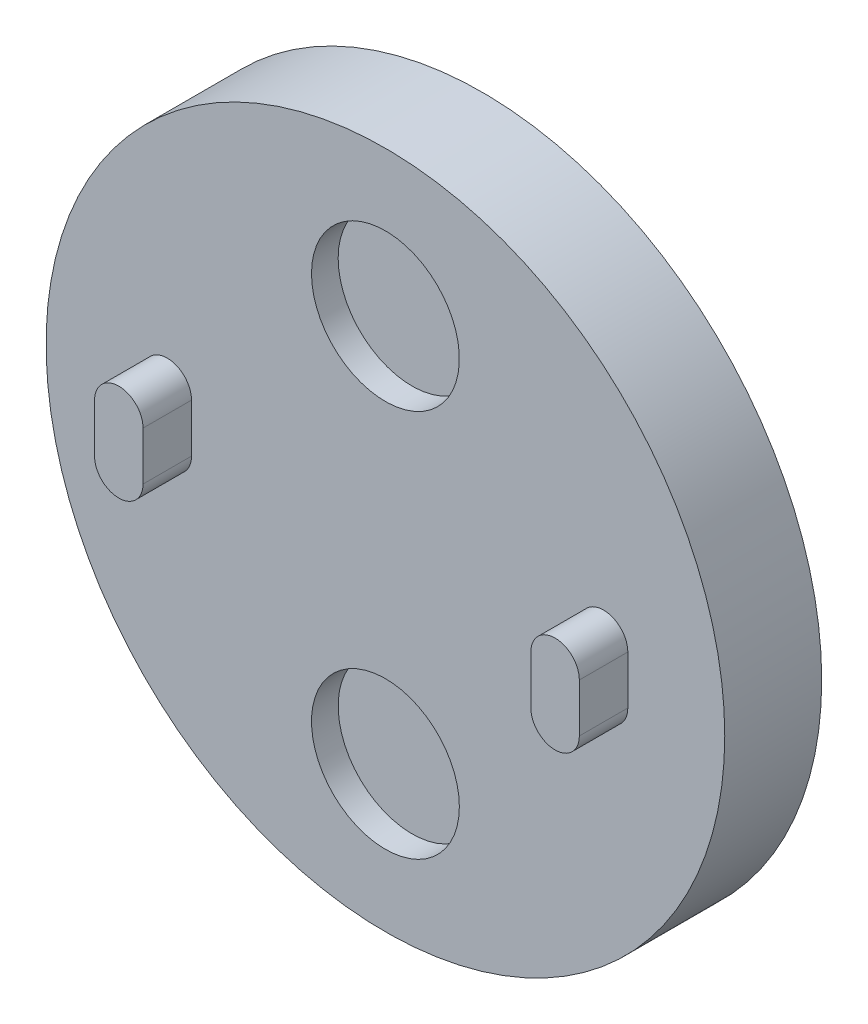
ISO-10303-21;
HEADER;
FILE_DESCRIPTION(('STEP AP214'),'2;1');
FILE_NAME('part.step','',(''),(''),'','','');
FILE_SCHEMA(('AUTOMOTIVE_DESIGN { 1 0 10303 214 1 1 1 1 }'));
ENDSEC;
DATA;
#1=APPLICATION_CONTEXT('core data for automotive mechanical design processes');
#2=APPLICATION_PROTOCOL_DEFINITION('international standard','automotive_design',2000,#1);
#3=PRODUCT_CONTEXT('',#1,'mechanical');
#4=PRODUCT('Part','Part','',(#3));
#5=PRODUCT_RELATED_PRODUCT_CATEGORY('part','',(#4));
#6=PRODUCT_DEFINITION_FORMATION('','',#4);
#7=PRODUCT_DEFINITION_CONTEXT('part definition',#1,'design');
#8=PRODUCT_DEFINITION('design','',#6,#7);
#9=PRODUCT_DEFINITION_SHAPE('','',#8);
#10=(LENGTH_UNIT() NAMED_UNIT(*) SI_UNIT(.MILLI.,.METRE.));
#11=(NAMED_UNIT(*) PLANE_ANGLE_UNIT() SI_UNIT($,.RADIAN.));
#12=(NAMED_UNIT(*) SI_UNIT($,.STERADIAN.) SOLID_ANGLE_UNIT());
#13=UNCERTAINTY_MEASURE_WITH_UNIT(LENGTH_MEASURE(1.E-05),#10,'distance_accuracy_value','');
#14=(GEOMETRIC_REPRESENTATION_CONTEXT(3) GLOBAL_UNCERTAINTY_ASSIGNED_CONTEXT((#13)) GLOBAL_UNIT_ASSIGNED_CONTEXT((#10,
#11,#12)) REPRESENTATION_CONTEXT('',''));
#15=CARTESIAN_POINT('',(0.,0.,0.));
#16=DIRECTION('',(0.,0.,1.));
#17=DIRECTION('',(1.,0.,0.));
#18=AXIS2_PLACEMENT_3D('',#15,#16,#17);
#19=CARTESIAN_POINT('',(0.,8.,-50.6128116588933));
#20=DIRECTION('',(0.,0.,1.));
#21=DIRECTION('',(1.,0.,0.));
#22=AXIS2_PLACEMENT_3D('',#19,#20,#21);
#23=PLANE('',#22);
#24=CARTESIAN_POINT('',(0.,0.,-50.6128116588933));
#25=DIRECTION('',(0.,0.,1.));
#26=DIRECTION('',(1.,0.,0.));
#27=AXIS2_PLACEMENT_3D('',#24,#25,#26);
#28=CIRCLE('',#27,3.05);
#29=CARTESIAN_POINT('',(3.05,0.,-50.6128116588933));
#30=VERTEX_POINT('',#29);
#31=EDGE_CURVE('E231',#30,#30,#28,.T.);
#32=ORIENTED_EDGE('',*,*,#31,.F.);
#33=EDGE_LOOP('',(#32));
#34=FACE_BOUND('',#33,.T.);
#35=CARTESIAN_POINT('',(0.,16.,-50.6128116588933));
#36=DIRECTION('',(0.,0.,1.));
#37=DIRECTION('',(-1.,0.,0.));
#38=AXIS2_PLACEMENT_3D('',#35,#36,#37);
#39=CIRCLE('',#38,3.05);
#40=CARTESIAN_POINT('',(-3.05,16.,-50.6128116588933));
#41=VERTEX_POINT('',#40);
#42=EDGE_CURVE('E234',#41,#41,#39,.T.);
#43=ORIENTED_EDGE('',*,*,#42,.F.);
#44=EDGE_LOOP('',(#43));
#45=FACE_BOUND('',#44,.T.);
#46=CARTESIAN_POINT('',(0.,8.,-50.6128116588933));
#47=DIRECTION('',(0.,0.,1.));
#48=DIRECTION('',(1.,0.,0.));
#49=AXIS2_PLACEMENT_3D('',#46,#47,#48);
#50=CIRCLE('',#49,14.);
#51=CARTESIAN_POINT('',(14.,8.,-50.6128116588933));
#52=VERTEX_POINT('',#51);
#53=EDGE_CURVE('E11',#52,#52,#50,.T.);
#54=ORIENTED_EDGE('',*,*,#53,.T.);
#55=EDGE_LOOP('',(#54));
#56=FACE_BOUND('',#55,.T.);
#57=DIRECTION('',(0.,-1.,0.));
#58=VECTOR('',#57,1.);
#59=CARTESIAN_POINT('',(-9.99999999999999,9.,-50.6128116588933));
#60=LINE('',#59,#58);
#61=CARTESIAN_POINT('',(-9.99999999999999,9.,-50.6128116588933));
#62=VERTEX_POINT('',#61);
#63=CARTESIAN_POINT('',(-9.99999999999999,7.,-50.6128116588933));
#64=VERTEX_POINT('',#63);
#65=EDGE_CURVE('E212',#62,#64,#60,.T.);
#66=ORIENTED_EDGE('',*,*,#65,.F.);
#67=CARTESIAN_POINT('',(-8.99999999999999,9.,-50.6128116588933));
#68=DIRECTION('',(0.,0.,1.));
#69=DIRECTION('',(1.,0.,0.));
#70=AXIS2_PLACEMENT_3D('',#67,#68,#69);
#71=CIRCLE('',#70,1.);
#72=CARTESIAN_POINT('',(-7.99999999999999,9.,-50.6128116588933));
#73=VERTEX_POINT('',#72);
#74=EDGE_CURVE('E191',#73,#62,#71,.T.);
#75=ORIENTED_EDGE('',*,*,#74,.F.);
#76=DIRECTION('',(0.,1.,0.));
#77=VECTOR('',#76,1.);
#78=CARTESIAN_POINT('',(-7.99999999999999,9.,-50.6128116588933));
#79=LINE('',#78,#77);
#80=CARTESIAN_POINT('',(-7.99999999999999,7.,-50.6128116588933));
#81=VERTEX_POINT('',#80);
#82=EDGE_CURVE('E203',#81,#73,#79,.T.);
#83=ORIENTED_EDGE('',*,*,#82,.F.);
#84=CARTESIAN_POINT('',(-8.99999999999999,7.,-50.6128116588933));
#85=DIRECTION('',(0.,0.,1.));
#86=DIRECTION('',(1.,0.,0.));
#87=AXIS2_PLACEMENT_3D('',#84,#85,#86);
#88=CIRCLE('',#87,1.);
#89=EDGE_CURVE('E214',#64,#81,#88,.T.);
#90=ORIENTED_EDGE('',*,*,#89,.F.);
#91=EDGE_LOOP('',(#66,#75,#83,#90));
#92=FACE_BOUND('',#91,.T.);
#93=DIRECTION('',(0.,-1.,0.));
#94=VECTOR('',#93,1.);
#95=CARTESIAN_POINT('',(8.00000000000001,9.,-50.6128116588933));
#96=LINE('',#95,#94);
#97=CARTESIAN_POINT('',(8.00000000000001,9.,-50.6128116588933));
#98=VERTEX_POINT('',#97);
#99=CARTESIAN_POINT('',(8.00000000000001,7.,-50.6128116588933));
#100=VERTEX_POINT('',#99);
#101=EDGE_CURVE('E186',#98,#100,#96,.T.);
#102=ORIENTED_EDGE('',*,*,#101,.F.);
#103=CARTESIAN_POINT('',(9.00000000000001,9.,-50.6128116588933));
#104=DIRECTION('',(0.,0.,1.));
#105=DIRECTION('',(-1.,0.,0.));
#106=AXIS2_PLACEMENT_3D('',#103,#104,#105);
#107=CIRCLE('',#106,1.);
#108=CARTESIAN_POINT('',(10.,9.,-50.6128116588933));
#109=VERTEX_POINT('',#108);
#110=EDGE_CURVE('E188',#109,#98,#107,.T.);
#111=ORIENTED_EDGE('',*,*,#110,.F.);
#112=DIRECTION('',(0.,1.,0.));
#113=VECTOR('',#112,1.);
#114=CARTESIAN_POINT('',(10.,9.,-50.6128116588933));
#115=LINE('',#114,#113);
#116=CARTESIAN_POINT('',(10.,7.,-50.6128116588933));
#117=VERTEX_POINT('',#116);
#118=EDGE_CURVE('E181',#117,#109,#115,.T.);
#119=ORIENTED_EDGE('',*,*,#118,.F.);
#120=CARTESIAN_POINT('',(9.00000000000001,7.,-50.6128116588933));
#121=DIRECTION('',(0.,0.,1.));
#122=DIRECTION('',(-1.,0.,0.));
#123=AXIS2_PLACEMENT_3D('',#120,#121,#122);
#124=CIRCLE('',#123,1.);
#125=EDGE_CURVE('E183',#100,#117,#124,.T.);
#126=ORIENTED_EDGE('',*,*,#125,.F.);
#127=EDGE_LOOP('',(#102,#111,#119,#126));
#128=FACE_BOUND('',#127,.T.);
#129=ADVANCED_FACE('F43',(#34,#45,#56,#92,#128),#23,.T.);
#130=CARTESIAN_POINT('',(0.,8.,-50.6128116588933));
#131=DIRECTION('',(0.,0.,-1.));
#132=DIRECTION('',(-1.,0.,0.));
#133=AXIS2_PLACEMENT_3D('',#130,#131,#132);
#134=CYLINDRICAL_SURFACE('',#133,14.);
#135=ORIENTED_EDGE('',*,*,#53,.F.);
#136=EDGE_LOOP('',(#135));
#137=FACE_BOUND('',#136,.T.);
#138=CARTESIAN_POINT('',(0.,8.,-54.6128116588933));
#139=DIRECTION('',(0.,0.,1.));
#140=DIRECTION('',(1.,0.,0.));
#141=AXIS2_PLACEMENT_3D('',#138,#139,#140);
#142=CIRCLE('',#141,14.);
#143=CARTESIAN_POINT('',(14.,8.,-54.6128116588933));
#144=VERTEX_POINT('',#143);
#145=EDGE_CURVE('E51',#144,#144,#142,.T.);
#146=ORIENTED_EDGE('',*,*,#145,.T.);
#147=EDGE_LOOP('',(#146));
#148=FACE_BOUND('',#147,.T.);
#149=ADVANCED_FACE('F45',(#137,#148),#134,.T.);
#150=CARTESIAN_POINT('',(0.,8.,-54.6128116588933));
#151=DIRECTION('',(0.,0.,1.));
#152=DIRECTION('',(1.,0.,0.));
#153=AXIS2_PLACEMENT_3D('',#150,#151,#152);
#154=PLANE('',#153);
#155=DIRECTION('',(0.,-1.,0.));
#156=VECTOR('',#155,1.);
#157=CARTESIAN_POINT('',(1.55,10.0248456731317,-54.6128116588933));
#158=LINE('',#157,#156);
#159=CARTESIAN_POINT('',(1.55,10.0248456731317,-54.6128116588933));
#160=VERTEX_POINT('',#159);
#161=CARTESIAN_POINT('',(1.55,5.97515432686833,-54.6128116588933));
#162=VERTEX_POINT('',#161);
#163=EDGE_CURVE('E162',#160,#162,#158,.T.);
#164=ORIENTED_EDGE('',*,*,#163,.F.);
#165=CARTESIAN_POINT('',(0.,7.99999999999999,-54.6128116588933));
#166=DIRECTION('',(0.,0.,-1.));
#167=DIRECTION('',(-1.,0.,0.));
#168=AXIS2_PLACEMENT_3D('',#165,#166,#167);
#169=CIRCLE('',#168,2.55);
#170=CARTESIAN_POINT('',(-1.55,10.0248456731317,-54.6128116588933));
#171=VERTEX_POINT('',#170);
#172=EDGE_CURVE('E58',#171,#160,#169,.T.);
#173=ORIENTED_EDGE('',*,*,#172,.F.);
#174=DIRECTION('',(0.,1.,0.));
#175=VECTOR('',#174,1.);
#176=CARTESIAN_POINT('',(-1.55,10.0248456731317,-54.6128116588933));
#177=LINE('',#176,#175);
#178=CARTESIAN_POINT('',(-1.55,5.97515432686833,-54.6128116588933));
#179=VERTEX_POINT('',#178);
#180=EDGE_CURVE('E153',#179,#171,#177,.T.);
#181=ORIENTED_EDGE('',*,*,#180,.F.);
#182=CARTESIAN_POINT('',(0.,7.99999999999999,-54.6128116588933));
#183=DIRECTION('',(0.,0.,-1.));
#184=DIRECTION('',(-1.,0.,0.));
#185=AXIS2_PLACEMENT_3D('',#182,#183,#184);
#186=CIRCLE('',#185,2.55);
#187=EDGE_CURVE('E156',#162,#179,#186,.T.);
#188=ORIENTED_EDGE('',*,*,#187,.F.);
#189=EDGE_LOOP('',(#164,#173,#181,#188));
#190=FACE_BOUND('',#189,.T.);
#191=ORIENTED_EDGE('',*,*,#145,.F.);
#192=EDGE_LOOP('',(#191));
#193=FACE_BOUND('',#192,.T.);
#194=ADVANCED_FACE('F242',(#190,#193),#154,.F.);
#195=CARTESIAN_POINT('',(0.,16.,-51.7128116588933));
#196=DIRECTION('',(0.,0.,1.));
#197=DIRECTION('',(1.,0.,0.));
#198=AXIS2_PLACEMENT_3D('',#195,#196,#197);
#199=CYLINDRICAL_SURFACE('',#198,3.05);
#200=CARTESIAN_POINT('',(0.,16.,-51.7128116588933));
#201=DIRECTION('',(0.,0.,1.));
#202=DIRECTION('',(-1.,0.,0.));
#203=AXIS2_PLACEMENT_3D('',#200,#201,#202);
#204=CIRCLE('',#203,3.05);
#205=CARTESIAN_POINT('',(-3.05,16.,-51.7128116588933));
#206=VERTEX_POINT('',#205);
#207=EDGE_CURVE('E227',#206,#206,#204,.T.);
#208=ORIENTED_EDGE('',*,*,#207,.F.);
#209=EDGE_LOOP('',(#208));
#210=FACE_BOUND('',#209,.T.);
#211=ORIENTED_EDGE('',*,*,#42,.T.);
#212=EDGE_LOOP('',(#211));
#213=FACE_BOUND('',#212,.T.);
#214=ADVANCED_FACE('F244',(#210,#213),#199,.F.);
#215=CARTESIAN_POINT('',(0.,16.,-51.7128116588933));
#216=DIRECTION('',(0.,0.,-1.));
#217=DIRECTION('',(-1.,0.,0.));
#218=AXIS2_PLACEMENT_3D('',#215,#216,#217);
#219=PLANE('',#218);
#220=ORIENTED_EDGE('',*,*,#207,.T.);
#221=EDGE_LOOP('',(#220));
#222=FACE_BOUND('',#221,.T.);
#223=ADVANCED_FACE('F251',(#222),#219,.F.);
#224=CARTESIAN_POINT('',(0.,0.,-51.7128116588933));
#225=DIRECTION('',(0.,0.,1.));
#226=DIRECTION('',(1.,0.,0.));
#227=AXIS2_PLACEMENT_3D('',#224,#225,#226);
#228=CYLINDRICAL_SURFACE('',#227,3.05);
#229=CARTESIAN_POINT('',(0.,0.,-51.7128116588933));
#230=DIRECTION('',(0.,0.,1.));
#231=DIRECTION('',(1.,0.,0.));
#232=AXIS2_PLACEMENT_3D('',#229,#230,#231);
#233=CIRCLE('',#232,3.05);
#234=CARTESIAN_POINT('',(3.05,0.,-51.7128116588933));
#235=VERTEX_POINT('',#234);
#236=EDGE_CURVE('E228',#235,#235,#233,.T.);
#237=ORIENTED_EDGE('',*,*,#236,.F.);
#238=EDGE_LOOP('',(#237));
#239=FACE_BOUND('',#238,.T.);
#240=ORIENTED_EDGE('',*,*,#31,.T.);
#241=EDGE_LOOP('',(#240));
#242=FACE_BOUND('',#241,.T.);
#243=ADVANCED_FACE('F321',(#239,#242),#228,.F.);
#244=CARTESIAN_POINT('',(0.,0.,-51.7128116588933));
#245=DIRECTION('',(0.,0.,1.));
#246=DIRECTION('',(1.,0.,0.));
#247=AXIS2_PLACEMENT_3D('',#244,#245,#246);
#248=PLANE('',#247);
#249=ORIENTED_EDGE('',*,*,#236,.T.);
#250=EDGE_LOOP('',(#249));
#251=FACE_BOUND('',#250,.T.);
#252=ADVANCED_FACE('F317',(#251),#248,.T.);
#253=CARTESIAN_POINT('',(-8.99999999999999,9.,-48.6128116588933));
#254=DIRECTION('',(0.,0.,-1.));
#255=DIRECTION('',(-1.,0.,0.));
#256=AXIS2_PLACEMENT_3D('',#253,#254,#255);
#257=CYLINDRICAL_SURFACE('',#256,1.);
#258=ORIENTED_EDGE('',*,*,#74,.T.);
#259=DIRECTION('',(0.,0.,-1.));
#260=VECTOR('',#259,1.);
#261=CARTESIAN_POINT('',(-9.99999999999999,9.,-48.6128116588933));
#262=LINE('',#261,#260);
#263=CARTESIAN_POINT('',(-9.99999999999999,9.,-48.6128116588933));
#264=VERTEX_POINT('',#263);
#265=EDGE_CURVE('E225',#264,#62,#262,.T.);
#266=ORIENTED_EDGE('',*,*,#265,.F.);
#267=CARTESIAN_POINT('',(-8.99999999999999,9.,-48.6128116588933));
#268=DIRECTION('',(0.,0.,1.));
#269=DIRECTION('',(1.,0.,0.));
#270=AXIS2_PLACEMENT_3D('',#267,#268,#269);
#271=CIRCLE('',#270,1.);
#272=CARTESIAN_POINT('',(-7.99999999999999,9.,-48.6128116588933));
#273=VERTEX_POINT('',#272);
#274=EDGE_CURVE('E199',#273,#264,#271,.T.);
#275=ORIENTED_EDGE('',*,*,#274,.F.);
#276=DIRECTION('',(0.,0.,-1.));
#277=VECTOR('',#276,1.);
#278=CARTESIAN_POINT('',(-7.99999999999999,9.,-48.6128116588933));
#279=LINE('',#278,#277);
#280=EDGE_CURVE('E209',#273,#73,#279,.T.);
#281=ORIENTED_EDGE('',*,*,#280,.T.);
#282=EDGE_LOOP('',(#258,#266,#275,#281));
#283=FACE_BOUND('',#282,.T.);
#284=ADVANCED_FACE('F313',(#283),#257,.T.);
#285=CARTESIAN_POINT('',(-9.99999999999999,9.,-48.6128116588933));
#286=DIRECTION('',(1.,0.,0.));
#287=DIRECTION('',(0.,0.,-1.));
#288=AXIS2_PLACEMENT_3D('',#285,#286,#287);
#289=PLANE('',#288);
#290=ORIENTED_EDGE('',*,*,#65,.T.);
#291=DIRECTION('',(0.,0.,-1.));
#292=VECTOR('',#291,1.);
#293=CARTESIAN_POINT('',(-9.99999999999999,7.,-48.6128116588933));
#294=LINE('',#293,#292);
#295=CARTESIAN_POINT('',(-9.99999999999999,7.,-48.6128116588933));
#296=VERTEX_POINT('',#295);
#297=EDGE_CURVE('E222',#296,#64,#294,.T.);
#298=ORIENTED_EDGE('',*,*,#297,.F.);
#299=DIRECTION('',(0.,-1.,0.));
#300=VECTOR('',#299,1.);
#301=CARTESIAN_POINT('',(-9.99999999999999,9.,-48.6128116588933));
#302=LINE('',#301,#300);
#303=EDGE_CURVE('E202',#264,#296,#302,.T.);
#304=ORIENTED_EDGE('',*,*,#303,.F.);
#305=ORIENTED_EDGE('',*,*,#265,.T.);
#306=EDGE_LOOP('',(#290,#298,#304,#305));
#307=FACE_BOUND('',#306,.T.);
#308=ADVANCED_FACE('F309',(#307),#289,.F.);
#309=CARTESIAN_POINT('',(-8.99999999999999,7.,-48.6128116588933));
#310=DIRECTION('',(0.,0.,-1.));
#311=DIRECTION('',(-1.,0.,0.));
#312=AXIS2_PLACEMENT_3D('',#309,#310,#311);
#313=CYLINDRICAL_SURFACE('',#312,1.);
#314=ORIENTED_EDGE('',*,*,#89,.T.);
#315=DIRECTION('',(0.,0.,-1.));
#316=VECTOR('',#315,1.);
#317=CARTESIAN_POINT('',(-7.99999999999999,7.,-48.6128116588933));
#318=LINE('',#317,#316);
#319=CARTESIAN_POINT('',(-7.99999999999999,7.,-48.6128116588933));
#320=VERTEX_POINT('',#319);
#321=EDGE_CURVE('E220',#320,#81,#318,.T.);
#322=ORIENTED_EDGE('',*,*,#321,.F.);
#323=CARTESIAN_POINT('',(-8.99999999999999,7.,-48.6128116588933));
#324=DIRECTION('',(0.,0.,1.));
#325=DIRECTION('',(1.,0.,0.));
#326=AXIS2_PLACEMENT_3D('',#323,#324,#325);
#327=CIRCLE('',#326,1.);
#328=EDGE_CURVE('E205',#296,#320,#327,.T.);
#329=ORIENTED_EDGE('',*,*,#328,.F.);
#330=ORIENTED_EDGE('',*,*,#297,.T.);
#331=EDGE_LOOP('',(#314,#322,#329,#330));
#332=FACE_BOUND('',#331,.T.);
#333=ADVANCED_FACE('F305',(#332),#313,.T.);
#334=CARTESIAN_POINT('',(-7.99999999999999,9.,-48.6128116588933));
#335=DIRECTION('',(-1.,0.,0.));
#336=DIRECTION('',(0.,0.,1.));
#337=AXIS2_PLACEMENT_3D('',#334,#335,#336);
#338=PLANE('',#337);
#339=ORIENTED_EDGE('',*,*,#82,.T.);
#340=ORIENTED_EDGE('',*,*,#280,.F.);
#341=DIRECTION('',(0.,1.,0.));
#342=VECTOR('',#341,1.);
#343=CARTESIAN_POINT('',(-7.99999999999999,9.,-48.6128116588933));
#344=LINE('',#343,#342);
#345=EDGE_CURVE('E207',#320,#273,#344,.T.);
#346=ORIENTED_EDGE('',*,*,#345,.F.);
#347=ORIENTED_EDGE('',*,*,#321,.T.);
#348=EDGE_LOOP('',(#339,#340,#346,#347));
#349=FACE_BOUND('',#348,.T.);
#350=ADVANCED_FACE('F301',(#349),#338,.F.);
#351=CARTESIAN_POINT('',(-8.99999999999999,9.,-48.6128116588933));
#352=DIRECTION('',(0.,0.,1.));
#353=DIRECTION('',(1.,0.,0.));
#354=AXIS2_PLACEMENT_3D('',#351,#352,#353);
#355=PLANE('',#354);
#356=ORIENTED_EDGE('',*,*,#274,.T.);
#357=ORIENTED_EDGE('',*,*,#303,.T.);
#358=ORIENTED_EDGE('',*,*,#328,.T.);
#359=ORIENTED_EDGE('',*,*,#345,.T.);
#360=EDGE_LOOP('',(#356,#357,#358,#359));
#361=FACE_BOUND('',#360,.T.);
#362=ADVANCED_FACE('F298',(#361),#355,.T.);
#363=CARTESIAN_POINT('',(9.00000000000001,9.,-48.6128116588933));
#364=DIRECTION('',(0.,0.,-1.));
#365=DIRECTION('',(-1.,0.,0.));
#366=AXIS2_PLACEMENT_3D('',#363,#364,#365);
#367=CYLINDRICAL_SURFACE('',#366,1.);
#368=ORIENTED_EDGE('',*,*,#110,.T.);
#369=DIRECTION('',(0.,0.,-1.));
#370=VECTOR('',#369,1.);
#371=CARTESIAN_POINT('',(8.00000000000001,9.,-48.6128116588933));
#372=LINE('',#371,#370);
#373=CARTESIAN_POINT('',(8.00000000000001,9.,-48.6128116588933));
#374=VERTEX_POINT('',#373);
#375=EDGE_CURVE('E168',#374,#98,#372,.T.);
#376=ORIENTED_EDGE('',*,*,#375,.F.);
#377=CARTESIAN_POINT('',(9.00000000000001,9.,-48.6128116588933));
#378=DIRECTION('',(0.,0.,1.));
#379=DIRECTION('',(-1.,0.,0.));
#380=AXIS2_PLACEMENT_3D('',#377,#378,#379);
#381=CIRCLE('',#380,1.);
#382=CARTESIAN_POINT('',(10.,9.,-48.6128116588933));
#383=VERTEX_POINT('',#382);
#384=EDGE_CURVE('E184',#383,#374,#381,.T.);
#385=ORIENTED_EDGE('',*,*,#384,.F.);
#386=DIRECTION('',(0.,0.,-1.));
#387=VECTOR('',#386,1.);
#388=CARTESIAN_POINT('',(10.,9.,-48.6128116588933));
#389=LINE('',#388,#387);
#390=EDGE_CURVE('E177',#383,#109,#389,.T.);
#391=ORIENTED_EDGE('',*,*,#390,.T.);
#392=EDGE_LOOP('',(#368,#376,#385,#391));
#393=FACE_BOUND('',#392,.T.);
#394=ADVANCED_FACE('F286',(#393),#367,.T.);
#395=CARTESIAN_POINT('',(8.00000000000001,9.,-48.6128116588933));
#396=DIRECTION('',(1.,0.,0.));
#397=DIRECTION('',(0.,0.,-1.));
#398=AXIS2_PLACEMENT_3D('',#395,#396,#397);
#399=PLANE('',#398);
#400=ORIENTED_EDGE('',*,*,#101,.T.);
#401=DIRECTION('',(0.,0.,-1.));
#402=VECTOR('',#401,1.);
#403=CARTESIAN_POINT('',(8.00000000000001,7.,-48.6128116588933));
#404=LINE('',#403,#402);
#405=CARTESIAN_POINT('',(8.00000000000001,7.,-48.6128116588933));
#406=VERTEX_POINT('',#405);
#407=EDGE_CURVE('E173',#406,#100,#404,.T.);
#408=ORIENTED_EDGE('',*,*,#407,.F.);
#409=DIRECTION('',(0.,-1.,0.));
#410=VECTOR('',#409,1.);
#411=CARTESIAN_POINT('',(8.00000000000001,9.,-48.6128116588933));
#412=LINE('',#411,#410);
#413=EDGE_CURVE('E195',#374,#406,#412,.T.);
#414=ORIENTED_EDGE('',*,*,#413,.F.);
#415=ORIENTED_EDGE('',*,*,#375,.T.);
#416=EDGE_LOOP('',(#400,#408,#414,#415));
#417=FACE_BOUND('',#416,.T.);
#418=ADVANCED_FACE('F276',(#417),#399,.F.);
#419=CARTESIAN_POINT('',(9.00000000000001,7.,-48.6128116588933));
#420=DIRECTION('',(0.,0.,-1.));
#421=DIRECTION('',(-1.,0.,0.));
#422=AXIS2_PLACEMENT_3D('',#419,#420,#421);
#423=CYLINDRICAL_SURFACE('',#422,1.);
#424=ORIENTED_EDGE('',*,*,#125,.T.);
#425=DIRECTION('',(0.,0.,-1.));
#426=VECTOR('',#425,1.);
#427=CARTESIAN_POINT('',(10.,7.,-48.6128116588933));
#428=LINE('',#427,#426);
#429=CARTESIAN_POINT('',(10.,7.,-48.6128116588933));
#430=VERTEX_POINT('',#429);
#431=EDGE_CURVE('E66',#430,#117,#428,.T.);
#432=ORIENTED_EDGE('',*,*,#431,.F.);
#433=CARTESIAN_POINT('',(9.00000000000001,7.,-48.6128116588933));
#434=DIRECTION('',(0.,0.,1.));
#435=DIRECTION('',(-1.,0.,0.));
#436=AXIS2_PLACEMENT_3D('',#433,#434,#435);
#437=CIRCLE('',#436,1.);
#438=EDGE_CURVE('E193',#406,#430,#437,.T.);
#439=ORIENTED_EDGE('',*,*,#438,.F.);
#440=ORIENTED_EDGE('',*,*,#407,.T.);
#441=EDGE_LOOP('',(#424,#432,#439,#440));
#442=FACE_BOUND('',#441,.T.);
#443=ADVANCED_FACE('F280',(#442),#423,.T.);
#444=CARTESIAN_POINT('',(10.,9.,-48.6128116588933));
#445=DIRECTION('',(-1.,0.,0.));
#446=DIRECTION('',(0.,0.,1.));
#447=AXIS2_PLACEMENT_3D('',#444,#445,#446);
#448=PLANE('',#447);
#449=ORIENTED_EDGE('',*,*,#118,.T.);
#450=ORIENTED_EDGE('',*,*,#390,.F.);
#451=DIRECTION('',(0.,1.,0.));
#452=VECTOR('',#451,1.);
#453=CARTESIAN_POINT('',(10.,9.,-48.6128116588933));
#454=LINE('',#453,#452);
#455=EDGE_CURVE('E180',#430,#383,#454,.T.);
#456=ORIENTED_EDGE('',*,*,#455,.F.);
#457=ORIENTED_EDGE('',*,*,#431,.T.);
#458=EDGE_LOOP('',(#449,#450,#456,#457));
#459=FACE_BOUND('',#458,.T.);
#460=ADVANCED_FACE('F287',(#459),#448,.F.);
#461=CARTESIAN_POINT('',(9.00000000000001,9.,-48.6128116588933));
#462=DIRECTION('',(0.,0.,-1.));
#463=DIRECTION('',(-1.,0.,0.));
#464=AXIS2_PLACEMENT_3D('',#461,#462,#463);
#465=PLANE('',#464);
#466=ORIENTED_EDGE('',*,*,#384,.T.);
#467=ORIENTED_EDGE('',*,*,#413,.T.);
#468=ORIENTED_EDGE('',*,*,#438,.T.);
#469=ORIENTED_EDGE('',*,*,#455,.T.);
#470=EDGE_LOOP('',(#466,#467,#468,#469));
#471=FACE_BOUND('',#470,.T.);
#472=ADVANCED_FACE('F282',(#471),#465,.F.);
#473=CARTESIAN_POINT('',(0.,7.99999999999999,-51.6128116588933));
#474=DIRECTION('',(0.,0.,-1.));
#475=DIRECTION('',(-1.,0.,0.));
#476=AXIS2_PLACEMENT_3D('',#473,#474,#475);
#477=CYLINDRICAL_SURFACE('',#476,2.55);
#478=ORIENTED_EDGE('',*,*,#172,.T.);
#479=DIRECTION('',(0.,0.,-1.));
#480=VECTOR('',#479,1.);
#481=CARTESIAN_POINT('',(1.55,10.0248456731317,-51.6128116588933));
#482=LINE('',#481,#480);
#483=CARTESIAN_POINT('',(1.55,10.0248456731317,-51.6128116588933));
#484=VERTEX_POINT('',#483);
#485=EDGE_CURVE('E131',#484,#160,#482,.T.);
#486=ORIENTED_EDGE('',*,*,#485,.F.);
#487=CARTESIAN_POINT('',(0.,7.99999999999999,-51.6128116588933));
#488=DIRECTION('',(0.,0.,-1.));
#489=DIRECTION('',(-1.,0.,0.));
#490=AXIS2_PLACEMENT_3D('',#487,#488,#489);
#491=CIRCLE('',#490,2.55);
#492=CARTESIAN_POINT('',(-1.55,10.0248456731317,-51.6128116588933));
#493=VERTEX_POINT('',#492);
#494=EDGE_CURVE('E135',#493,#484,#491,.T.);
#495=ORIENTED_EDGE('',*,*,#494,.F.);
#496=DIRECTION('',(0.,0.,-1.));
#497=VECTOR('',#496,1.);
#498=CARTESIAN_POINT('',(-1.55,10.0248456731317,-51.6128116588933));
#499=LINE('',#498,#497);
#500=EDGE_CURVE('E166',#493,#171,#499,.T.);
#501=ORIENTED_EDGE('',*,*,#500,.T.);
#502=EDGE_LOOP('',(#478,#486,#495,#501));
#503=FACE_BOUND('',#502,.T.);
#504=ADVANCED_FACE('F133',(#503),#477,.F.);
#505=CARTESIAN_POINT('',(-1.55,10.0248456731317,-51.6128116588933));
#506=DIRECTION('',(-1.,0.,0.));
#507=DIRECTION('',(0.,-1.,0.));
#508=AXIS2_PLACEMENT_3D('',#505,#506,#507);
#509=PLANE('',#508);
#510=ORIENTED_EDGE('',*,*,#180,.T.);
#511=ORIENTED_EDGE('',*,*,#500,.F.);
#512=DIRECTION('',(0.,1.,0.));
#513=VECTOR('',#512,1.);
#514=CARTESIAN_POINT('',(-1.55,10.0248456731317,-51.6128116588933));
#515=LINE('',#514,#513);
#516=CARTESIAN_POINT('',(-1.55,5.97515432686833,-51.6128116588933));
#517=VERTEX_POINT('',#516);
#518=EDGE_CURVE('E141',#517,#493,#515,.T.);
#519=ORIENTED_EDGE('',*,*,#518,.F.);
#520=DIRECTION('',(0.,0.,-1.));
#521=VECTOR('',#520,1.);
#522=CARTESIAN_POINT('',(-1.55,5.97515432686833,-51.6128116588933));
#523=LINE('',#522,#521);
#524=EDGE_CURVE('E169',#517,#179,#523,.T.);
#525=ORIENTED_EDGE('',*,*,#524,.T.);
#526=EDGE_LOOP('',(#510,#511,#519,#525));
#527=FACE_BOUND('',#526,.T.);
#528=ADVANCED_FACE('F406',(#527),#509,.F.);
#529=CARTESIAN_POINT('',(0.,7.99999999999999,-51.6128116588933));
#530=DIRECTION('',(0.,0.,-1.));
#531=DIRECTION('',(-1.,0.,0.));
#532=AXIS2_PLACEMENT_3D('',#529,#530,#531);
#533=CYLINDRICAL_SURFACE('',#532,2.55);
#534=ORIENTED_EDGE('',*,*,#187,.T.);
#535=ORIENTED_EDGE('',*,*,#524,.F.);
#536=CARTESIAN_POINT('',(0.,7.99999999999999,-51.6128116588933));
#537=DIRECTION('',(0.,0.,-1.));
#538=DIRECTION('',(-1.,0.,0.));
#539=AXIS2_PLACEMENT_3D('',#536,#537,#538);
#540=CIRCLE('',#539,2.55);
#541=CARTESIAN_POINT('',(1.55,5.97515432686833,-51.6128116588933));
#542=VERTEX_POINT('',#541);
#543=EDGE_CURVE('E149',#542,#517,#540,.T.);
#544=ORIENTED_EDGE('',*,*,#543,.F.);
#545=DIRECTION('',(0.,0.,-1.));
#546=VECTOR('',#545,1.);
#547=CARTESIAN_POINT('',(1.55,5.97515432686833,-51.6128116588933));
#548=LINE('',#547,#546);
#549=EDGE_CURVE('E140',#542,#162,#548,.T.);
#550=ORIENTED_EDGE('',*,*,#549,.T.);
#551=EDGE_LOOP('',(#534,#535,#544,#550));
#552=FACE_BOUND('',#551,.T.);
#553=ADVANCED_FACE('F416',(#552),#533,.F.);
#554=CARTESIAN_POINT('',(1.55,10.0248456731317,-51.6128116588933));
#555=DIRECTION('',(1.,0.,0.));
#556=DIRECTION('',(0.,1.,0.));
#557=AXIS2_PLACEMENT_3D('',#554,#555,#556);
#558=PLANE('',#557);
#559=ORIENTED_EDGE('',*,*,#163,.T.);
#560=ORIENTED_EDGE('',*,*,#549,.F.);
#561=DIRECTION('',(0.,-1.,0.));
#562=VECTOR('',#561,1.);
#563=CARTESIAN_POINT('',(1.55,10.0248456731317,-51.6128116588933));
#564=LINE('',#563,#562);
#565=EDGE_CURVE('E144',#484,#542,#564,.T.);
#566=ORIENTED_EDGE('',*,*,#565,.F.);
#567=ORIENTED_EDGE('',*,*,#485,.T.);
#568=EDGE_LOOP('',(#559,#560,#566,#567));
#569=FACE_BOUND('',#568,.T.);
#570=ADVANCED_FACE('F145',(#569),#558,.F.);
#571=CARTESIAN_POINT('',(0.,7.99999999999999,-51.6128116588933));
#572=DIRECTION('',(0.,0.,-1.));
#573=DIRECTION('',(-1.,0.,0.));
#574=AXIS2_PLACEMENT_3D('',#571,#572,#573);
#575=PLANE('',#574);
#576=ORIENTED_EDGE('',*,*,#494,.T.);
#577=ORIENTED_EDGE('',*,*,#565,.T.);
#578=ORIENTED_EDGE('',*,*,#543,.T.);
#579=ORIENTED_EDGE('',*,*,#518,.T.);
#580=EDGE_LOOP('',(#576,#577,#578,#579));
#581=FACE_BOUND('',#580,.T.);
#582=ADVANCED_FACE('F151',(#581),#575,.T.);
#583=CLOSED_SHELL('',(#129,#149,#194,#214,#223,#243,#252,#284,#308,#333,#350,#362,#394,#418,
#443,#460,#472,#504,#528,#553,#570,#582));
#584=MANIFOLD_SOLID_BREP('B2',#583);
#585=ADVANCED_BREP_SHAPE_REPRESENTATION('',(#18,#584),#14);
#586=SHAPE_DEFINITION_REPRESENTATION(#9,#585);
ENDSEC;
END-ISO-10303-21;
